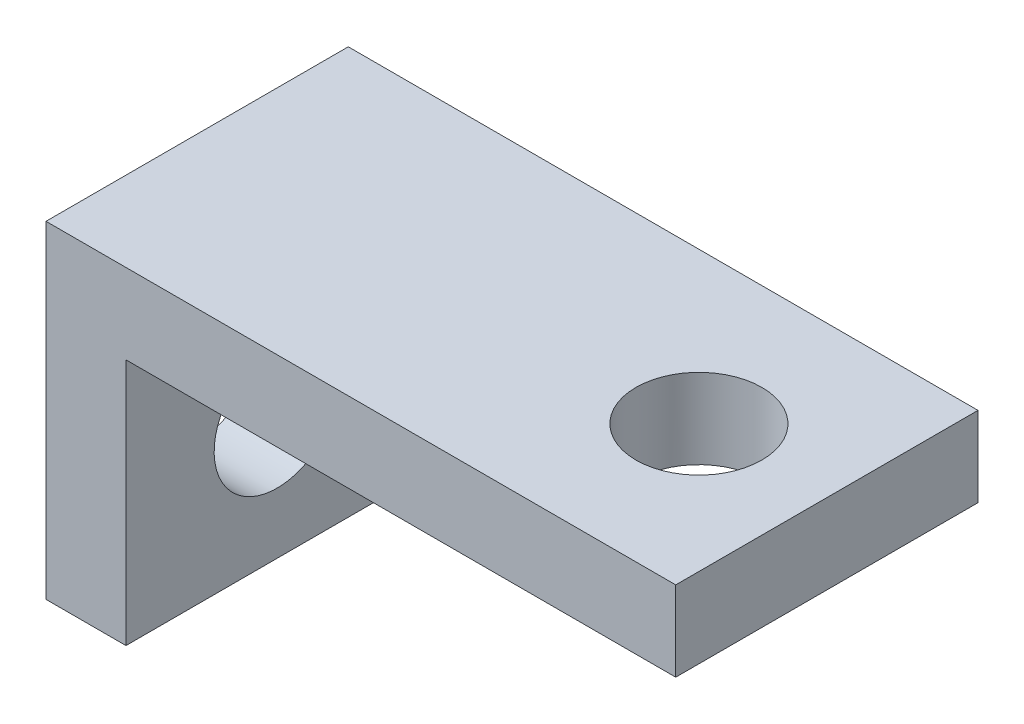
ISO-10303-21;
HEADER;
FILE_DESCRIPTION(('STEP AP214'),'2;1');
FILE_NAME('part.step','',(''),(''),'','','');
FILE_SCHEMA(('AUTOMOTIVE_DESIGN { 1 0 10303 214 1 1 1 1 }'));
ENDSEC;
DATA;
#1=APPLICATION_CONTEXT('core data for automotive mechanical design processes');
#2=APPLICATION_PROTOCOL_DEFINITION('international standard','automotive_design',2000,#1);
#3=PRODUCT_CONTEXT('',#1,'mechanical');
#4=PRODUCT('Part','Part','',(#3));
#5=PRODUCT_RELATED_PRODUCT_CATEGORY('part','',(#4));
#6=PRODUCT_DEFINITION_FORMATION('','',#4);
#7=PRODUCT_DEFINITION_CONTEXT('part definition',#1,'design');
#8=PRODUCT_DEFINITION('design','',#6,#7);
#9=PRODUCT_DEFINITION_SHAPE('','',#8);
#10=(LENGTH_UNIT() NAMED_UNIT(*) SI_UNIT(.MILLI.,.METRE.));
#11=(NAMED_UNIT(*) PLANE_ANGLE_UNIT() SI_UNIT($,.RADIAN.));
#12=(NAMED_UNIT(*) SI_UNIT($,.STERADIAN.) SOLID_ANGLE_UNIT());
#13=UNCERTAINTY_MEASURE_WITH_UNIT(LENGTH_MEASURE(1.E-05),#10,'distance_accuracy_value','');
#14=(GEOMETRIC_REPRESENTATION_CONTEXT(3) GLOBAL_UNCERTAINTY_ASSIGNED_CONTEXT((#13)) GLOBAL_UNIT_ASSIGNED_CONTEXT((#10,
#11,#12)) REPRESENTATION_CONTEXT('',''));
#15=CARTESIAN_POINT('',(0.,0.,0.));
#16=DIRECTION('',(0.,0.,1.));
#17=DIRECTION('',(1.,0.,0.));
#18=AXIS2_PLACEMENT_3D('',#15,#16,#17);
#19=CARTESIAN_POINT('',(0.,-3.99175,6.));
#20=DIRECTION('',(0.,1.,0.));
#21=DIRECTION('',(0.,0.,1.));
#22=AXIS2_PLACEMENT_3D('',#19,#20,#21);
#23=PLANE('',#22);
#24=DIRECTION('',(1.,0.,0.));
#25=VECTOR('',#24,1.);
#26=CARTESIAN_POINT('',(0.,-3.99175,0.));
#27=LINE('',#26,#25);
#28=CARTESIAN_POINT('',(-0.381,-3.99175,0.));
#29=VERTEX_POINT('',#28);
#30=CARTESIAN_POINT('',(1.2065,-3.99175,0.));
#31=VERTEX_POINT('',#30);
#32=EDGE_CURVE('E132',#29,#31,#27,.T.);
#33=ORIENTED_EDGE('',*,*,#32,.T.);
#34=DIRECTION('',(0.,0.,-1.));
#35=VECTOR('',#34,1.);
#36=CARTESIAN_POINT('',(1.2065,-3.99175,6.));
#37=LINE('',#36,#35);
#38=CARTESIAN_POINT('',(1.2065,-3.99175,6.));
#39=VERTEX_POINT('',#38);
#40=EDGE_CURVE('E11',#39,#31,#37,.T.);
#41=ORIENTED_EDGE('',*,*,#40,.F.);
#42=DIRECTION('',(1.,0.,0.));
#43=VECTOR('',#42,1.);
#44=CARTESIAN_POINT('',(0.,-3.99175,6.));
#45=LINE('',#44,#43);
#46=CARTESIAN_POINT('',(-0.381,-3.99175,6.));
#47=VERTEX_POINT('',#46);
#48=EDGE_CURVE('E152',#47,#39,#45,.T.);
#49=ORIENTED_EDGE('',*,*,#48,.F.);
#50=DIRECTION('',(0.,0.,-1.));
#51=VECTOR('',#50,1.);
#52=CARTESIAN_POINT('',(-0.381,-3.99175,6.));
#53=LINE('',#52,#51);
#54=EDGE_CURVE('E60',#47,#29,#53,.T.);
#55=ORIENTED_EDGE('',*,*,#54,.T.);
#56=EDGE_LOOP('',(#33,#41,#49,#55));
#57=FACE_BOUND('',#56,.T.);
#58=ADVANCED_FACE('F41',(#57),#23,.F.);
#59=CARTESIAN_POINT('',(1.2065,0.,6.));
#60=DIRECTION('',(-1.,0.,0.));
#61=DIRECTION('',(0.,-1.,0.));
#62=AXIS2_PLACEMENT_3D('',#59,#60,#61);
#63=PLANE('',#62);
#64=CARTESIAN_POINT('',(1.2065,-1.5355,3.));
#65=DIRECTION('',(1.,0.,0.));
#66=DIRECTION('',(0.,1.,0.));
#67=AXIS2_PLACEMENT_3D('',#64,#65,#66);
#68=CIRCLE('',#67,1.25);
#69=CARTESIAN_POINT('',(1.2065,-0.285499999999996,3.));
#70=VERTEX_POINT('',#69);
#71=EDGE_CURVE('E163',#70,#70,#68,.T.);
#72=ORIENTED_EDGE('',*,*,#71,.F.);
#73=EDGE_LOOP('',(#72));
#74=FACE_BOUND('',#73,.T.);
#75=DIRECTION('',(0.,1.,0.));
#76=VECTOR('',#75,1.);
#77=CARTESIAN_POINT('',(1.2065,0.,0.));
#78=LINE('',#77,#76);
#79=CARTESIAN_POINT('',(1.2065,0.920750000000004,0.));
#80=VERTEX_POINT('',#79);
#81=EDGE_CURVE('E135',#31,#80,#78,.T.);
#82=ORIENTED_EDGE('',*,*,#81,.T.);
#83=DIRECTION('',(0.,0.,-1.));
#84=VECTOR('',#83,1.);
#85=CARTESIAN_POINT('',(1.2065,0.920750000000004,6.));
#86=LINE('',#85,#84);
#87=CARTESIAN_POINT('',(1.2065,0.920750000000004,6.));
#88=VERTEX_POINT('',#87);
#89=EDGE_CURVE('E51',#88,#80,#86,.T.);
#90=ORIENTED_EDGE('',*,*,#89,.F.);
#91=DIRECTION('',(0.,1.,0.));
#92=VECTOR('',#91,1.);
#93=CARTESIAN_POINT('',(1.2065,0.,6.));
#94=LINE('',#93,#92);
#95=EDGE_CURVE('E92',#39,#88,#94,.T.);
#96=ORIENTED_EDGE('',*,*,#95,.F.);
#97=ORIENTED_EDGE('',*,*,#40,.T.);
#98=EDGE_LOOP('',(#82,#90,#96,#97));
#99=FACE_BOUND('',#98,.T.);
#100=ADVANCED_FACE('F181',(#74,#99),#63,.F.);
#101=CARTESIAN_POINT('',(0.,0.920750000000004,6.));
#102=DIRECTION('',(0.,1.,0.));
#103=DIRECTION('',(0.,0.,1.));
#104=AXIS2_PLACEMENT_3D('',#101,#102,#103);
#105=PLANE('',#104);
#106=CARTESIAN_POINT('',(9.579,0.920750000000004,3.));
#107=DIRECTION('',(0.,-1.,0.));
#108=DIRECTION('',(0.,0.,-1.));
#109=AXIS2_PLACEMENT_3D('',#106,#107,#108);
#110=CIRCLE('',#109,1.25);
#111=CARTESIAN_POINT('',(9.579,0.920750000000004,1.75));
#112=VERTEX_POINT('',#111);
#113=EDGE_CURVE('E173',#112,#112,#110,.T.);
#114=ORIENTED_EDGE('',*,*,#113,.F.);
#115=EDGE_LOOP('',(#114));
#116=FACE_BOUND('',#115,.T.);
#117=DIRECTION('',(1.,0.,0.));
#118=VECTOR('',#117,1.);
#119=CARTESIAN_POINT('',(0.,0.920750000000004,0.));
#120=LINE('',#119,#118);
#121=CARTESIAN_POINT('',(12.119,0.920750000000004,0.));
#122=VERTEX_POINT('',#121);
#123=EDGE_CURVE('E139',#80,#122,#120,.T.);
#124=ORIENTED_EDGE('',*,*,#123,.T.);
#125=DIRECTION('',(0.,0.,-1.));
#126=VECTOR('',#125,1.);
#127=CARTESIAN_POINT('',(12.119,0.920750000000004,6.));
#128=LINE('',#127,#126);
#129=CARTESIAN_POINT('',(12.119,0.920750000000004,6.));
#130=VERTEX_POINT('',#129);
#131=EDGE_CURVE('E112',#130,#122,#128,.T.);
#132=ORIENTED_EDGE('',*,*,#131,.F.);
#133=DIRECTION('',(1.,0.,0.));
#134=VECTOR('',#133,1.);
#135=CARTESIAN_POINT('',(0.,0.920750000000004,6.));
#136=LINE('',#135,#134);
#137=EDGE_CURVE('E120',#88,#130,#136,.T.);
#138=ORIENTED_EDGE('',*,*,#137,.F.);
#139=ORIENTED_EDGE('',*,*,#89,.T.);
#140=EDGE_LOOP('',(#124,#132,#138,#139));
#141=FACE_BOUND('',#140,.T.);
#142=ADVANCED_FACE('F184',(#116,#141),#105,.F.);
#143=CARTESIAN_POINT('',(12.119,0.,6.));
#144=DIRECTION('',(1.,0.,0.));
#145=DIRECTION('',(0.,0.,-1.));
#146=AXIS2_PLACEMENT_3D('',#143,#144,#145);
#147=PLANE('',#146);
#148=DIRECTION('',(0.,-1.,0.));
#149=VECTOR('',#148,1.);
#150=CARTESIAN_POINT('',(12.119,0.,0.));
#151=LINE('',#150,#149);
#152=CARTESIAN_POINT('',(12.119,2.50825,0.));
#153=VERTEX_POINT('',#152);
#154=EDGE_CURVE('E107',#153,#122,#151,.T.);
#155=ORIENTED_EDGE('',*,*,#154,.F.);
#156=DIRECTION('',(0.,0.,-1.));
#157=VECTOR('',#156,1.);
#158=CARTESIAN_POINT('',(12.119,2.50825,6.));
#159=LINE('',#158,#157);
#160=CARTESIAN_POINT('',(12.119,2.50825,6.));
#161=VERTEX_POINT('',#160);
#162=EDGE_CURVE('E102',#161,#153,#159,.T.);
#163=ORIENTED_EDGE('',*,*,#162,.F.);
#164=DIRECTION('',(0.,-1.,0.));
#165=VECTOR('',#164,1.);
#166=CARTESIAN_POINT('',(12.119,0.,6.));
#167=LINE('',#166,#165);
#168=EDGE_CURVE('E105',#161,#130,#167,.T.);
#169=ORIENTED_EDGE('',*,*,#168,.T.);
#170=ORIENTED_EDGE('',*,*,#131,.T.);
#171=EDGE_LOOP('',(#155,#163,#169,#170));
#172=FACE_BOUND('',#171,.T.);
#173=ADVANCED_FACE('F104',(#172),#147,.T.);
#174=CARTESIAN_POINT('',(0.,2.50825,6.));
#175=DIRECTION('',(0.,1.,0.));
#176=DIRECTION('',(0.,0.,1.));
#177=AXIS2_PLACEMENT_3D('',#174,#175,#176);
#178=PLANE('',#177);
#179=CARTESIAN_POINT('',(9.579,2.50825,3.));
#180=DIRECTION('',(0.,1.,0.));
#181=DIRECTION('',(0.,0.,1.));
#182=AXIS2_PLACEMENT_3D('',#179,#180,#181);
#183=CIRCLE('',#182,1.25);
#184=CARTESIAN_POINT('',(9.579,2.50825,4.25));
#185=VERTEX_POINT('',#184);
#186=EDGE_CURVE('E44',#185,#185,#183,.T.);
#187=ORIENTED_EDGE('',*,*,#186,.F.);
#188=EDGE_LOOP('',(#187));
#189=FACE_BOUND('',#188,.T.);
#190=DIRECTION('',(1.,0.,0.));
#191=VECTOR('',#190,1.);
#192=CARTESIAN_POINT('',(0.,2.50825,0.));
#193=LINE('',#192,#191);
#194=CARTESIAN_POINT('',(-0.381,2.50825,0.));
#195=VERTEX_POINT('',#194);
#196=EDGE_CURVE('E145',#195,#153,#193,.T.);
#197=ORIENTED_EDGE('',*,*,#196,.F.);
#198=DIRECTION('',(0.,0.,-1.));
#199=VECTOR('',#198,1.);
#200=CARTESIAN_POINT('',(-0.381,2.50825,6.));
#201=LINE('',#200,#199);
#202=CARTESIAN_POINT('',(-0.381,2.50825,6.));
#203=VERTEX_POINT('',#202);
#204=EDGE_CURVE('E80',#203,#195,#201,.T.);
#205=ORIENTED_EDGE('',*,*,#204,.F.);
#206=DIRECTION('',(1.,0.,0.));
#207=VECTOR('',#206,1.);
#208=CARTESIAN_POINT('',(0.,2.50825,6.));
#209=LINE('',#208,#207);
#210=EDGE_CURVE('E118',#203,#161,#209,.T.);
#211=ORIENTED_EDGE('',*,*,#210,.T.);
#212=ORIENTED_EDGE('',*,*,#162,.T.);
#213=EDGE_LOOP('',(#197,#205,#211,#212));
#214=FACE_BOUND('',#213,.T.);
#215=ADVANCED_FACE('F124',(#189,#214),#178,.T.);
#216=CARTESIAN_POINT('',(-0.381,0.,6.));
#217=DIRECTION('',(-1.,0.,0.));
#218=DIRECTION('',(0.,0.,1.));
#219=AXIS2_PLACEMENT_3D('',#216,#217,#218);
#220=PLANE('',#219);
#221=CARTESIAN_POINT('',(-0.381,-1.5355,3.));
#222=DIRECTION('',(-1.,0.,0.));
#223=DIRECTION('',(0.,0.,1.));
#224=AXIS2_PLACEMENT_3D('',#221,#222,#223);
#225=CIRCLE('',#224,1.25);
#226=CARTESIAN_POINT('',(-0.381,-1.5355,4.25));
#227=VERTEX_POINT('',#226);
#228=EDGE_CURVE('E136',#227,#227,#225,.T.);
#229=ORIENTED_EDGE('',*,*,#228,.F.);
#230=EDGE_LOOP('',(#229));
#231=FACE_BOUND('',#230,.T.);
#232=DIRECTION('',(0.,1.,0.));
#233=VECTOR('',#232,1.);
#234=CARTESIAN_POINT('',(-0.381,0.,0.));
#235=LINE('',#234,#233);
#236=EDGE_CURVE('E148',#29,#195,#235,.T.);
#237=ORIENTED_EDGE('',*,*,#236,.F.);
#238=ORIENTED_EDGE('',*,*,#54,.F.);
#239=DIRECTION('',(0.,1.,0.));
#240=VECTOR('',#239,1.);
#241=CARTESIAN_POINT('',(-0.381,0.,6.));
#242=LINE('',#241,#240);
#243=EDGE_CURVE('E126',#47,#203,#242,.T.);
#244=ORIENTED_EDGE('',*,*,#243,.T.);
#245=ORIENTED_EDGE('',*,*,#204,.T.);
#246=EDGE_LOOP('',(#237,#238,#244,#245));
#247=FACE_BOUND('',#246,.T.);
#248=ADVANCED_FACE('F187',(#231,#247),#220,.T.);
#249=CARTESIAN_POINT('',(0.,0.,6.));
#250=DIRECTION('',(0.,0.,1.));
#251=DIRECTION('',(1.,0.,0.));
#252=AXIS2_PLACEMENT_3D('',#249,#250,#251);
#253=PLANE('',#252);
#254=ORIENTED_EDGE('',*,*,#48,.T.);
#255=ORIENTED_EDGE('',*,*,#95,.T.);
#256=ORIENTED_EDGE('',*,*,#137,.T.);
#257=ORIENTED_EDGE('',*,*,#168,.F.);
#258=ORIENTED_EDGE('',*,*,#210,.F.);
#259=ORIENTED_EDGE('',*,*,#243,.F.);
#260=EDGE_LOOP('',(#254,#255,#256,#257,#258,#259));
#261=FACE_BOUND('',#260,.T.);
#262=ADVANCED_FACE('F116',(#261),#253,.T.);
#263=CARTESIAN_POINT('',(0.,0.,0.));
#264=DIRECTION('',(0.,0.,1.));
#265=DIRECTION('',(1.,0.,0.));
#266=AXIS2_PLACEMENT_3D('',#263,#264,#265);
#267=PLANE('',#266);
#268=ORIENTED_EDGE('',*,*,#32,.F.);
#269=ORIENTED_EDGE('',*,*,#236,.T.);
#270=ORIENTED_EDGE('',*,*,#196,.T.);
#271=ORIENTED_EDGE('',*,*,#154,.T.);
#272=ORIENTED_EDGE('',*,*,#123,.F.);
#273=ORIENTED_EDGE('',*,*,#81,.F.);
#274=EDGE_LOOP('',(#268,#269,#270,#271,#272,#273));
#275=FACE_BOUND('',#274,.T.);
#276=ADVANCED_FACE('F186',(#275),#267,.F.);
#277=CARTESIAN_POINT('',(-4.7935,-1.5355,3.));
#278=DIRECTION('',(1.,0.,0.));
#279=DIRECTION('',(0.,1.,0.));
#280=AXIS2_PLACEMENT_3D('',#277,#278,#279);
#281=CYLINDRICAL_SURFACE('',#280,1.25);
#282=ORIENTED_EDGE('',*,*,#228,.T.);
#283=EDGE_LOOP('',(#282));
#284=FACE_BOUND('',#283,.T.);
#285=ORIENTED_EDGE('',*,*,#71,.T.);
#286=EDGE_LOOP('',(#285));
#287=FACE_BOUND('',#286,.T.);
#288=ADVANCED_FACE('F234',(#284,#287),#281,.F.);
#289=CARTESIAN_POINT('',(9.579,6.92075,3.));
#290=DIRECTION('',(0.,-1.,0.));
#291=DIRECTION('',(0.,0.,-1.));
#292=AXIS2_PLACEMENT_3D('',#289,#290,#291);
#293=CYLINDRICAL_SURFACE('',#292,1.25);
#294=ORIENTED_EDGE('',*,*,#186,.T.);
#295=EDGE_LOOP('',(#294));
#296=FACE_BOUND('',#295,.T.);
#297=ORIENTED_EDGE('',*,*,#113,.T.);
#298=EDGE_LOOP('',(#297));
#299=FACE_BOUND('',#298,.T.);
#300=ADVANCED_FACE('F230',(#296,#299),#293,.F.);
#301=CLOSED_SHELL('',(#58,#100,#142,#173,#215,#248,#262,#276,#288,#300));
#302=MANIFOLD_SOLID_BREP('B2',#301);
#303=ADVANCED_BREP_SHAPE_REPRESENTATION('',(#18,#302),#14);
#304=SHAPE_DEFINITION_REPRESENTATION(#9,#303);
ENDSEC;
END-ISO-10303-21;
